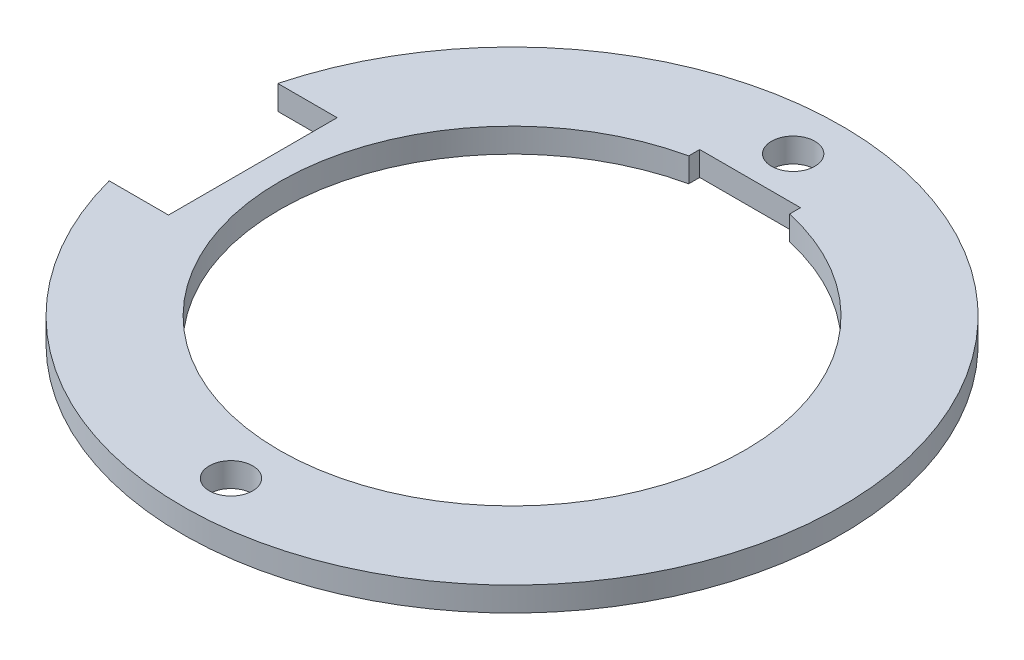
ISO-10303-21;
HEADER;
FILE_DESCRIPTION(('STEP AP214'),'2;1');
FILE_NAME('part.step','',(''),(''),'','','');
FILE_SCHEMA(('AUTOMOTIVE_DESIGN { 1 0 10303 214 1 1 1 1 }'));
ENDSEC;
DATA;
#1=APPLICATION_CONTEXT('core data for automotive mechanical design processes');
#2=APPLICATION_PROTOCOL_DEFINITION('international standard','automotive_design',2000,#1);
#3=PRODUCT_CONTEXT('',#1,'mechanical');
#4=PRODUCT('Part','Part','',(#3));
#5=PRODUCT_RELATED_PRODUCT_CATEGORY('part','',(#4));
#6=PRODUCT_DEFINITION_FORMATION('','',#4);
#7=PRODUCT_DEFINITION_CONTEXT('part definition',#1,'design');
#8=PRODUCT_DEFINITION('design','',#6,#7);
#9=PRODUCT_DEFINITION_SHAPE('','',#8);
#10=(LENGTH_UNIT() NAMED_UNIT(*) SI_UNIT(.MILLI.,.METRE.));
#11=(NAMED_UNIT(*) PLANE_ANGLE_UNIT() SI_UNIT($,.RADIAN.));
#12=(NAMED_UNIT(*) SI_UNIT($,.STERADIAN.) SOLID_ANGLE_UNIT());
#13=UNCERTAINTY_MEASURE_WITH_UNIT(LENGTH_MEASURE(1.E-05),#10,'distance_accuracy_value','');
#14=(GEOMETRIC_REPRESENTATION_CONTEXT(3) GLOBAL_UNCERTAINTY_ASSIGNED_CONTEXT((#13)) GLOBAL_UNIT_ASSIGNED_CONTEXT((#10,
#11,#12)) REPRESENTATION_CONTEXT('',''));
#15=CARTESIAN_POINT('',(0.,0.,0.));
#16=DIRECTION('',(0.,0.,1.));
#17=DIRECTION('',(1.,0.,0.));
#18=AXIS2_PLACEMENT_3D('',#15,#16,#17);
#19=CARTESIAN_POINT('',(0.,0.79375,0.));
#20=DIRECTION('',(0.,-1.,0.));
#21=DIRECTION('',(0.,0.,-1.));
#22=AXIS2_PLACEMENT_3D('',#19,#20,#21);
#23=CYLINDRICAL_SURFACE('',#22,15.24);
#24=CARTESIAN_POINT('',(0.,-0.79375,0.));
#25=DIRECTION('',(0.,1.,0.));
#26=DIRECTION('',(0.,0.,1.));
#27=AXIS2_PLACEMENT_3D('',#24,#25,#26);
#28=CIRCLE('',#27,15.24);
#29=CARTESIAN_POINT('',(-3.302,-0.79375,-14.8779835999372));
#30=VERTEX_POINT('',#29);
#31=CARTESIAN_POINT('',(3.302,-0.79375,-14.8779835999372));
#32=VERTEX_POINT('',#31);
#33=EDGE_CURVE('E153',#30,#32,#28,.T.);
#34=ORIENTED_EDGE('',*,*,#33,.F.);
#35=DIRECTION('',(0.,-1.,0.));
#36=VECTOR('',#35,1.);
#37=CARTESIAN_POINT('',(-3.302,0.79375,-14.8779835999372));
#38=LINE('',#37,#36);
#39=CARTESIAN_POINT('',(-3.302,0.79375,-14.8779835999372));
#40=VERTEX_POINT('',#39);
#41=EDGE_CURVE('E11',#40,#30,#38,.T.);
#42=ORIENTED_EDGE('',*,*,#41,.F.);
#43=CARTESIAN_POINT('',(0.,0.79375,0.));
#44=DIRECTION('',(0.,1.,0.));
#45=DIRECTION('',(0.,0.,1.));
#46=AXIS2_PLACEMENT_3D('',#43,#44,#45);
#47=CIRCLE('',#46,15.24);
#48=CARTESIAN_POINT('',(3.302,0.79375,-14.8779835999372));
#49=VERTEX_POINT('',#48);
#50=EDGE_CURVE('E125',#40,#49,#47,.T.);
#51=ORIENTED_EDGE('',*,*,#50,.T.);
#52=DIRECTION('',(0.,-1.,0.));
#53=VECTOR('',#52,1.);
#54=CARTESIAN_POINT('',(3.302,0.79375,-14.8779835999372));
#55=LINE('',#54,#53);
#56=EDGE_CURVE('E76',#49,#32,#55,.T.);
#57=ORIENTED_EDGE('',*,*,#56,.T.);
#58=EDGE_LOOP('',(#34,#42,#51,#57));
#59=FACE_BOUND('',#58,.T.);
#60=ADVANCED_FACE('F33',(#59),#23,.F.);
#61=CARTESIAN_POINT('',(-3.30199999999999,0.79375,0.));
#62=DIRECTION('',(1.,0.,0.));
#63=DIRECTION('',(0.,0.,-1.));
#64=AXIS2_PLACEMENT_3D('',#61,#62,#63);
#65=PLANE('',#64);
#66=DIRECTION('',(0.,0.,1.));
#67=VECTOR('',#66,1.);
#68=CARTESIAN_POINT('',(-3.30199999999999,-0.79375,0.));
#69=LINE('',#68,#67);
#70=CARTESIAN_POINT('',(-3.302,-0.79375,-15.5956));
#71=VERTEX_POINT('',#70);
#72=EDGE_CURVE('E151',#71,#30,#69,.T.);
#73=ORIENTED_EDGE('',*,*,#72,.F.);
#74=DIRECTION('',(0.,-1.,0.));
#75=VECTOR('',#74,1.);
#76=CARTESIAN_POINT('',(-3.302,0.79375,-15.5956));
#77=LINE('',#76,#75);
#78=CARTESIAN_POINT('',(-3.302,0.79375,-15.5956));
#79=VERTEX_POINT('',#78);
#80=EDGE_CURVE('E40',#79,#71,#77,.T.);
#81=ORIENTED_EDGE('',*,*,#80,.F.);
#82=DIRECTION('',(0.,0.,1.));
#83=VECTOR('',#82,1.);
#84=CARTESIAN_POINT('',(-3.30199999999999,0.79375,0.));
#85=LINE('',#84,#83);
#86=EDGE_CURVE('E128',#79,#40,#85,.T.);
#87=ORIENTED_EDGE('',*,*,#86,.T.);
#88=ORIENTED_EDGE('',*,*,#41,.T.);
#89=EDGE_LOOP('',(#73,#81,#87,#88));
#90=FACE_BOUND('',#89,.T.);
#91=ADVANCED_FACE('F152',(#90),#65,.T.);
#92=CARTESIAN_POINT('',(0.,0.79375,-15.5956));
#93=DIRECTION('',(0.,0.,-1.));
#94=DIRECTION('',(-1.,0.,0.));
#95=AXIS2_PLACEMENT_3D('',#92,#93,#94);
#96=PLANE('',#95);
#97=DIRECTION('',(1.,0.,0.));
#98=VECTOR('',#97,1.);
#99=CARTESIAN_POINT('',(0.,-0.79375,-15.5956));
#100=LINE('',#99,#98);
#101=CARTESIAN_POINT('',(3.302,-0.79375,-15.5956));
#102=VERTEX_POINT('',#101);
#103=EDGE_CURVE('E130',#71,#102,#100,.T.);
#104=ORIENTED_EDGE('',*,*,#103,.T.);
#105=DIRECTION('',(0.,-1.,0.));
#106=VECTOR('',#105,1.);
#107=CARTESIAN_POINT('',(3.302,0.79375,-15.5956));
#108=LINE('',#107,#106);
#109=CARTESIAN_POINT('',(3.302,0.79375,-15.5956));
#110=VERTEX_POINT('',#109);
#111=EDGE_CURVE('E135',#110,#102,#108,.T.);
#112=ORIENTED_EDGE('',*,*,#111,.F.);
#113=DIRECTION('',(1.,0.,0.));
#114=VECTOR('',#113,1.);
#115=CARTESIAN_POINT('',(0.,0.79375,-15.5956));
#116=LINE('',#115,#114);
#117=EDGE_CURVE('E142',#79,#110,#116,.T.);
#118=ORIENTED_EDGE('',*,*,#117,.F.);
#119=ORIENTED_EDGE('',*,*,#80,.T.);
#120=EDGE_LOOP('',(#104,#112,#118,#119));
#121=FACE_BOUND('',#120,.T.);
#122=ADVANCED_FACE('F140',(#121),#96,.F.);
#123=CARTESIAN_POINT('',(3.302,0.79375,0.));
#124=DIRECTION('',(1.,0.,0.));
#125=DIRECTION('',(0.,0.,-1.));
#126=AXIS2_PLACEMENT_3D('',#123,#124,#125);
#127=PLANE('',#126);
#128=DIRECTION('',(0.,0.,1.));
#129=VECTOR('',#128,1.);
#130=CARTESIAN_POINT('',(3.302,-0.79375,0.));
#131=LINE('',#130,#129);
#132=EDGE_CURVE('E126',#102,#32,#131,.T.);
#133=ORIENTED_EDGE('',*,*,#132,.T.);
#134=ORIENTED_EDGE('',*,*,#56,.F.);
#135=DIRECTION('',(0.,0.,1.));
#136=VECTOR('',#135,1.);
#137=CARTESIAN_POINT('',(3.302,0.79375,0.));
#138=LINE('',#137,#136);
#139=EDGE_CURVE('E56',#110,#49,#138,.T.);
#140=ORIENTED_EDGE('',*,*,#139,.F.);
#141=ORIENTED_EDGE('',*,*,#111,.T.);
#142=EDGE_LOOP('',(#133,#134,#140,#141));
#143=FACE_BOUND('',#142,.T.);
#144=ADVANCED_FACE('F211',(#143),#127,.F.);
#145=CARTESIAN_POINT('',(0.,0.79375,0.));
#146=DIRECTION('',(0.,-1.,0.));
#147=DIRECTION('',(0.,0.,-1.));
#148=AXIS2_PLACEMENT_3D('',#145,#146,#147);
#149=CYLINDRICAL_SURFACE('',#148,21.59);
#150=CARTESIAN_POINT('',(0.,-0.79375,0.));
#151=DIRECTION('',(0.,1.,0.));
#152=DIRECTION('',(0.,0.,1.));
#153=AXIS2_PLACEMENT_3D('',#150,#151,#152);
#154=CIRCLE('',#153,21.59);
#155=CARTESIAN_POINT('',(-20.8712242034338,-0.79375,5.5245));
#156=VERTEX_POINT('',#155);
#157=CARTESIAN_POINT('',(-20.8712242034338,-0.79375,-5.5245));
#158=VERTEX_POINT('',#157);
#159=EDGE_CURVE('E117',#156,#158,#154,.T.);
#160=ORIENTED_EDGE('',*,*,#159,.T.);
#161=DIRECTION('',(0.,1.,0.));
#162=VECTOR('',#161,1.);
#163=CARTESIAN_POINT('',(-20.8712242034338,-0.79375,-5.5245));
#164=LINE('',#163,#162);
#165=CARTESIAN_POINT('',(-20.8712242034338,0.79375,-5.5245));
#166=VERTEX_POINT('',#165);
#167=EDGE_CURVE('E171',#158,#166,#164,.T.);
#168=ORIENTED_EDGE('',*,*,#167,.T.);
#169=CARTESIAN_POINT('',(0.,0.79375,0.));
#170=DIRECTION('',(0.,1.,0.));
#171=DIRECTION('',(0.,0.,1.));
#172=AXIS2_PLACEMENT_3D('',#169,#170,#171);
#173=CIRCLE('',#172,21.59);
#174=CARTESIAN_POINT('',(-20.8712242034338,0.79375,5.5245));
#175=VERTEX_POINT('',#174);
#176=EDGE_CURVE('E119',#175,#166,#173,.T.);
#177=ORIENTED_EDGE('',*,*,#176,.F.);
#178=DIRECTION('',(0.,1.,0.));
#179=VECTOR('',#178,1.);
#180=CARTESIAN_POINT('',(-20.8712242034338,-0.79375,5.5245));
#181=LINE('',#180,#179);
#182=EDGE_CURVE('E105',#156,#175,#181,.T.);
#183=ORIENTED_EDGE('',*,*,#182,.F.);
#184=EDGE_LOOP('',(#160,#168,#177,#183));
#185=FACE_BOUND('',#184,.T.);
#186=ADVANCED_FACE('F115',(#185),#149,.T.);
#187=CARTESIAN_POINT('',(0.,0.79375,0.));
#188=DIRECTION('',(0.,1.,0.));
#189=DIRECTION('',(0.,0.,1.));
#190=AXIS2_PLACEMENT_3D('',#187,#188,#189);
#191=PLANE('',#190);
#192=DIRECTION('',(-1.,0.,0.));
#193=VECTOR('',#192,1.);
#194=CARTESIAN_POINT('',(-20.8712242034338,0.79375,-5.5245));
#195=LINE('',#194,#193);
#196=CARTESIAN_POINT('',(-16.9840587441892,0.79375,-5.5245));
#197=VERTEX_POINT('',#196);
#198=EDGE_CURVE('E110',#197,#166,#195,.T.);
#199=ORIENTED_EDGE('',*,*,#198,.F.);
#200=DIRECTION('',(0.,0.,-1.));
#201=VECTOR('',#200,1.);
#202=CARTESIAN_POINT('',(-16.9840587441892,0.79375,-5.5245));
#203=LINE('',#202,#201);
#204=CARTESIAN_POINT('',(-16.9840587441892,0.79375,5.5245));
#205=VERTEX_POINT('',#204);
#206=EDGE_CURVE('E179',#205,#197,#203,.T.);
#207=ORIENTED_EDGE('',*,*,#206,.F.);
#208=DIRECTION('',(1.,0.,0.));
#209=VECTOR('',#208,1.);
#210=CARTESIAN_POINT('',(-16.9840587441892,0.79375,5.5245));
#211=LINE('',#210,#209);
#212=EDGE_CURVE('E182',#175,#205,#211,.T.);
#213=ORIENTED_EDGE('',*,*,#212,.F.);
#214=ORIENTED_EDGE('',*,*,#176,.T.);
#215=EDGE_LOOP('',(#199,#207,#213,#214));
#216=FACE_BOUND('',#215,.T.);
#217=CARTESIAN_POINT('',(0.,0.79375,18.415));
#218=DIRECTION('',(0.,1.,0.));
#219=DIRECTION('',(0.,0.,1.));
#220=AXIS2_PLACEMENT_3D('',#217,#218,#219);
#221=CIRCLE('',#220,1.4224);
#222=CARTESIAN_POINT('',(0.,0.79375,19.8374));
#223=VERTEX_POINT('',#222);
#224=EDGE_CURVE('E168',#223,#223,#221,.T.);
#225=ORIENTED_EDGE('',*,*,#224,.F.);
#226=EDGE_LOOP('',(#225));
#227=FACE_BOUND('',#226,.T.);
#228=CARTESIAN_POINT('',(0.,0.79375,-18.415));
#229=DIRECTION('',(0.,1.,0.));
#230=DIRECTION('',(0.,0.,1.));
#231=AXIS2_PLACEMENT_3D('',#228,#229,#230);
#232=CIRCLE('',#231,1.4224);
#233=CARTESIAN_POINT('',(0.,0.79375,-16.9926));
#234=VERTEX_POINT('',#233);
#235=EDGE_CURVE('E162',#234,#234,#232,.T.);
#236=ORIENTED_EDGE('',*,*,#235,.F.);
#237=EDGE_LOOP('',(#236));
#238=FACE_BOUND('',#237,.T.);
#239=ORIENTED_EDGE('',*,*,#50,.F.);
#240=ORIENTED_EDGE('',*,*,#86,.F.);
#241=ORIENTED_EDGE('',*,*,#117,.T.);
#242=ORIENTED_EDGE('',*,*,#139,.T.);
#243=EDGE_LOOP('',(#239,#240,#241,#242));
#244=FACE_BOUND('',#243,.T.);
#245=ADVANCED_FACE('F188',(#216,#227,#238,#244),#191,.T.);
#246=CARTESIAN_POINT('',(0.,-0.79375,0.));
#247=DIRECTION('',(0.,1.,0.));
#248=DIRECTION('',(0.,0.,1.));
#249=AXIS2_PLACEMENT_3D('',#246,#247,#248);
#250=PLANE('',#249);
#251=CARTESIAN_POINT('',(0.,-0.79375,18.415));
#252=DIRECTION('',(0.,1.,0.));
#253=DIRECTION('',(0.,0.,1.));
#254=AXIS2_PLACEMENT_3D('',#251,#252,#253);
#255=CIRCLE('',#254,1.4224);
#256=CARTESIAN_POINT('',(0.,-0.79375,19.8374));
#257=VERTEX_POINT('',#256);
#258=EDGE_CURVE('E165',#257,#257,#255,.T.);
#259=ORIENTED_EDGE('',*,*,#258,.T.);
#260=EDGE_LOOP('',(#259));
#261=FACE_BOUND('',#260,.T.);
#262=CARTESIAN_POINT('',(0.,-0.79375,-18.415));
#263=DIRECTION('',(0.,1.,0.));
#264=DIRECTION('',(0.,0.,1.));
#265=AXIS2_PLACEMENT_3D('',#262,#263,#264);
#266=CIRCLE('',#265,1.4224);
#267=CARTESIAN_POINT('',(0.,-0.79375,-16.9926));
#268=VERTEX_POINT('',#267);
#269=EDGE_CURVE('E155',#268,#268,#266,.T.);
#270=ORIENTED_EDGE('',*,*,#269,.T.);
#271=EDGE_LOOP('',(#270));
#272=FACE_BOUND('',#271,.T.);
#273=ORIENTED_EDGE('',*,*,#33,.T.);
#274=ORIENTED_EDGE('',*,*,#132,.F.);
#275=ORIENTED_EDGE('',*,*,#103,.F.);
#276=ORIENTED_EDGE('',*,*,#72,.T.);
#277=EDGE_LOOP('',(#273,#274,#275,#276));
#278=FACE_BOUND('',#277,.T.);
#279=DIRECTION('',(0.,0.,-1.));
#280=VECTOR('',#279,1.);
#281=CARTESIAN_POINT('',(-16.9840587441892,-0.79375,-5.5245));
#282=LINE('',#281,#280);
#283=CARTESIAN_POINT('',(-16.9840587441892,-0.79375,5.5245));
#284=VERTEX_POINT('',#283);
#285=CARTESIAN_POINT('',(-16.9840587441892,-0.79375,-5.5245));
#286=VERTEX_POINT('',#285);
#287=EDGE_CURVE('E47',#284,#286,#282,.T.);
#288=ORIENTED_EDGE('',*,*,#287,.T.);
#289=DIRECTION('',(-1.,0.,0.));
#290=VECTOR('',#289,1.);
#291=CARTESIAN_POINT('',(-20.8712242034338,-0.79375,-5.5245));
#292=LINE('',#291,#290);
#293=EDGE_CURVE('E120',#286,#158,#292,.T.);
#294=ORIENTED_EDGE('',*,*,#293,.T.);
#295=ORIENTED_EDGE('',*,*,#159,.F.);
#296=DIRECTION('',(1.,0.,0.));
#297=VECTOR('',#296,1.);
#298=CARTESIAN_POINT('',(-16.9840587441892,-0.79375,5.5245));
#299=LINE('',#298,#297);
#300=EDGE_CURVE('E101',#156,#284,#299,.T.);
#301=ORIENTED_EDGE('',*,*,#300,.T.);
#302=EDGE_LOOP('',(#288,#294,#295,#301));
#303=FACE_BOUND('',#302,.T.);
#304=ADVANCED_FACE('F123',(#261,#272,#278,#303),#250,.F.);
#305=CARTESIAN_POINT('',(0.,-0.79375,-18.415));
#306=DIRECTION('',(0.,1.,0.));
#307=DIRECTION('',(0.,0.,1.));
#308=AXIS2_PLACEMENT_3D('',#305,#306,#307);
#309=CYLINDRICAL_SURFACE('',#308,1.4224);
#310=ORIENTED_EDGE('',*,*,#269,.F.);
#311=EDGE_LOOP('',(#310));
#312=FACE_BOUND('',#311,.T.);
#313=ORIENTED_EDGE('',*,*,#235,.T.);
#314=EDGE_LOOP('',(#313));
#315=FACE_BOUND('',#314,.T.);
#316=ADVANCED_FACE('F201',(#312,#315),#309,.F.);
#317=CARTESIAN_POINT('',(0.,-0.79375,18.415));
#318=DIRECTION('',(0.,1.,0.));
#319=DIRECTION('',(0.,0.,1.));
#320=AXIS2_PLACEMENT_3D('',#317,#318,#319);
#321=CYLINDRICAL_SURFACE('',#320,1.4224);
#322=ORIENTED_EDGE('',*,*,#258,.F.);
#323=EDGE_LOOP('',(#322));
#324=FACE_BOUND('',#323,.T.);
#325=ORIENTED_EDGE('',*,*,#224,.T.);
#326=EDGE_LOOP('',(#325));
#327=FACE_BOUND('',#326,.T.);
#328=ADVANCED_FACE('F194',(#324,#327),#321,.F.);
#329=CARTESIAN_POINT('',(-20.8712242034338,-0.79375,-5.5245));
#330=DIRECTION('',(0.,0.,-1.));
#331=DIRECTION('',(-1.,0.,0.));
#332=AXIS2_PLACEMENT_3D('',#329,#330,#331);
#333=PLANE('',#332);
#334=ORIENTED_EDGE('',*,*,#198,.T.);
#335=ORIENTED_EDGE('',*,*,#167,.F.);
#336=ORIENTED_EDGE('',*,*,#293,.F.);
#337=DIRECTION('',(0.,1.,0.));
#338=VECTOR('',#337,1.);
#339=CARTESIAN_POINT('',(-16.9840587441892,-0.79375,-5.5245));
#340=LINE('',#339,#338);
#341=EDGE_CURVE('E175',#286,#197,#340,.T.);
#342=ORIENTED_EDGE('',*,*,#341,.T.);
#343=EDGE_LOOP('',(#334,#335,#336,#342));
#344=FACE_BOUND('',#343,.T.);
#345=ADVANCED_FACE('F192',(#344),#333,.F.);
#346=CARTESIAN_POINT('',(-16.9840587441892,-0.79375,-5.5245));
#347=DIRECTION('',(1.,0.,0.));
#348=DIRECTION('',(0.,0.,-1.));
#349=AXIS2_PLACEMENT_3D('',#346,#347,#348);
#350=PLANE('',#349);
#351=ORIENTED_EDGE('',*,*,#206,.T.);
#352=ORIENTED_EDGE('',*,*,#341,.F.);
#353=ORIENTED_EDGE('',*,*,#287,.F.);
#354=DIRECTION('',(0.,1.,0.));
#355=VECTOR('',#354,1.);
#356=CARTESIAN_POINT('',(-16.9840587441892,-0.79375,5.5245));
#357=LINE('',#356,#355);
#358=EDGE_CURVE('E107',#284,#205,#357,.T.);
#359=ORIENTED_EDGE('',*,*,#358,.T.);
#360=EDGE_LOOP('',(#351,#352,#353,#359));
#361=FACE_BOUND('',#360,.T.);
#362=ADVANCED_FACE('F190',(#361),#350,.F.);
#363=CARTESIAN_POINT('',(-16.9840587441892,-0.79375,5.5245));
#364=DIRECTION('',(0.,0.,1.));
#365=DIRECTION('',(1.,0.,0.));
#366=AXIS2_PLACEMENT_3D('',#363,#364,#365);
#367=PLANE('',#366);
#368=ORIENTED_EDGE('',*,*,#212,.T.);
#369=ORIENTED_EDGE('',*,*,#358,.F.);
#370=ORIENTED_EDGE('',*,*,#300,.F.);
#371=ORIENTED_EDGE('',*,*,#182,.T.);
#372=EDGE_LOOP('',(#368,#369,#370,#371));
#373=FACE_BOUND('',#372,.T.);
#374=ADVANCED_FACE('F104',(#373),#367,.F.);
#375=CLOSED_SHELL('',(#60,#91,#122,#144,#186,#245,#304,#316,#328,#345,#362,#374));
#376=MANIFOLD_SOLID_BREP('B2',#375);
#377=ADVANCED_BREP_SHAPE_REPRESENTATION('',(#18,#376),#14);
#378=SHAPE_DEFINITION_REPRESENTATION(#9,#377);
ENDSEC;
END-ISO-10303-21;
